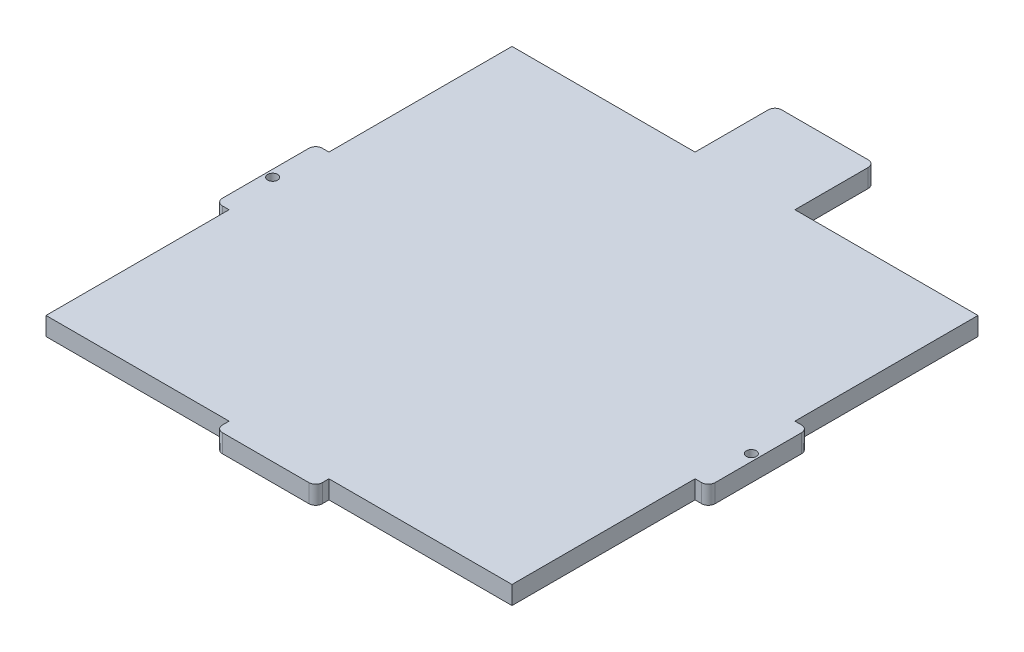
ISO-10303-21;
HEADER;
FILE_DESCRIPTION(('STEP AP214'),'2;1');
FILE_NAME('part.step','',(''),(''),'','','');
FILE_SCHEMA(('AUTOMOTIVE_DESIGN { 1 0 10303 214 1 1 1 1 }'));
ENDSEC;
DATA;
#1=APPLICATION_CONTEXT('core data for automotive mechanical design processes');
#2=APPLICATION_PROTOCOL_DEFINITION('international standard','automotive_design',2000,#1);
#3=PRODUCT_CONTEXT('',#1,'mechanical');
#4=PRODUCT('Part','Part','',(#3));
#5=PRODUCT_RELATED_PRODUCT_CATEGORY('part','',(#4));
#6=PRODUCT_DEFINITION_FORMATION('','',#4);
#7=PRODUCT_DEFINITION_CONTEXT('part definition',#1,'design');
#8=PRODUCT_DEFINITION('design','',#6,#7);
#9=PRODUCT_DEFINITION_SHAPE('','',#8);
#10=(LENGTH_UNIT() NAMED_UNIT(*) SI_UNIT(.MILLI.,.METRE.));
#11=(NAMED_UNIT(*) PLANE_ANGLE_UNIT() SI_UNIT($,.RADIAN.));
#12=(NAMED_UNIT(*) SI_UNIT($,.STERADIAN.) SOLID_ANGLE_UNIT());
#13=UNCERTAINTY_MEASURE_WITH_UNIT(LENGTH_MEASURE(1.E-05),#10,'distance_accuracy_value','');
#14=(GEOMETRIC_REPRESENTATION_CONTEXT(3) GLOBAL_UNCERTAINTY_ASSIGNED_CONTEXT((#13)) GLOBAL_UNIT_ASSIGNED_CONTEXT((#10,
#11,#12)) REPRESENTATION_CONTEXT('',''));
#15=CARTESIAN_POINT('',(0.,0.,0.));
#16=DIRECTION('',(0.,0.,1.));
#17=DIRECTION('',(1.,0.,0.));
#18=AXIS2_PLACEMENT_3D('',#15,#16,#17);
#19=CARTESIAN_POINT('',(0.,5.5,0.));
#20=DIRECTION('',(0.,1.,0.));
#21=DIRECTION('',(0.,0.,1.));
#22=AXIS2_PLACEMENT_3D('',#19,#20,#21);
#23=PLANE('',#22);
#24=CARTESIAN_POINT('',(-1.9,5.5,-70.));
#25=DIRECTION('',(0.,1.,0.));
#26=DIRECTION('',(0.,0.,1.));
#27=AXIS2_PLACEMENT_3D('',#24,#25,#26);
#28=CIRCLE('',#27,1.5);
#29=CARTESIAN_POINT('',(-1.9,5.5,-68.5));
#30=VERTEX_POINT('',#29);
#31=EDGE_CURVE('E453',#30,#30,#28,.T.);
#32=ORIENTED_EDGE('',*,*,#31,.F.);
#33=EDGE_LOOP('',(#32));
#34=FACE_BOUND('',#33,.T.);
#35=DIRECTION('',(-1.,0.,0.));
#36=VECTOR('',#35,1.);
#37=CARTESIAN_POINT('',(55.,5.5,-164.));
#38=LINE('',#37,#36);
#39=CARTESIAN_POINT('',(83.,5.5,-164.));
#40=VERTEX_POINT('',#39);
#41=CARTESIAN_POINT('',(57.,5.5,-164.));
#42=VERTEX_POINT('',#41);
#43=EDGE_CURVE('E437',#40,#42,#38,.T.);
#44=ORIENTED_EDGE('',*,*,#43,.T.);
#45=CARTESIAN_POINT('',(57.,5.5,-162.));
#46=DIRECTION('',(0.,1.,0.));
#47=DIRECTION('',(0.,0.,1.));
#48=AXIS2_PLACEMENT_3D('',#45,#46,#47);
#49=CIRCLE('',#48,2.);
#50=CARTESIAN_POINT('',(55.,5.5,-162.));
#51=VERTEX_POINT('',#50);
#52=EDGE_CURVE('E286',#42,#51,#49,.T.);
#53=ORIENTED_EDGE('',*,*,#52,.T.);
#54=DIRECTION('',(0.,0.,1.));
#55=VECTOR('',#54,1.);
#56=CARTESIAN_POINT('',(55.,5.5,-140.));
#57=LINE('',#56,#55);
#58=CARTESIAN_POINT('',(55.,5.5,-140.));
#59=VERTEX_POINT('',#58);
#60=EDGE_CURVE('E439',#51,#59,#57,.T.);
#61=ORIENTED_EDGE('',*,*,#60,.T.);
#62=DIRECTION('',(-1.,0.,0.));
#63=VECTOR('',#62,1.);
#64=CARTESIAN_POINT('',(0.,5.5,-140.));
#65=LINE('',#64,#63);
#66=CARTESIAN_POINT('',(0.,5.5,-140.));
#67=VERTEX_POINT('',#66);
#68=EDGE_CURVE('E441',#59,#67,#65,.T.);
#69=ORIENTED_EDGE('',*,*,#68,.T.);
#70=DIRECTION('',(0.,0.,1.));
#71=VECTOR('',#70,1.);
#72=CARTESIAN_POINT('',(0.,5.5,-85.));
#73=LINE('',#72,#71);
#74=CARTESIAN_POINT('',(0.,5.5,-85.));
#75=VERTEX_POINT('',#74);
#76=EDGE_CURVE('E443',#67,#75,#73,.T.);
#77=ORIENTED_EDGE('',*,*,#76,.T.);
#78=DIRECTION('',(-1.,0.,0.));
#79=VECTOR('',#78,1.);
#80=CARTESIAN_POINT('',(0.,5.5,-85.));
#81=LINE('',#80,#79);
#82=CARTESIAN_POINT('',(-2.,5.5,-85.));
#83=VERTEX_POINT('',#82);
#84=EDGE_CURVE('E445',#75,#83,#81,.T.);
#85=ORIENTED_EDGE('',*,*,#84,.T.);
#86=CARTESIAN_POINT('',(-2.,5.5,-83.));
#87=DIRECTION('',(0.,1.,0.));
#88=DIRECTION('',(0.,0.,1.));
#89=AXIS2_PLACEMENT_3D('',#86,#87,#88);
#90=CIRCLE('',#89,2.);
#91=CARTESIAN_POINT('',(-4.,5.5,-83.));
#92=VERTEX_POINT('',#91);
#93=EDGE_CURVE('E284',#83,#92,#90,.T.);
#94=ORIENTED_EDGE('',*,*,#93,.T.);
#95=DIRECTION('',(0.,0.,1.));
#96=VECTOR('',#95,1.);
#97=CARTESIAN_POINT('',(-4.,5.5,-85.));
#98=LINE('',#97,#96);
#99=CARTESIAN_POINT('',(-4.,5.5,-57.));
#100=VERTEX_POINT('',#99);
#101=EDGE_CURVE('E448',#92,#100,#98,.T.);
#102=ORIENTED_EDGE('',*,*,#101,.T.);
#103=CARTESIAN_POINT('',(-2.,5.5,-57.));
#104=DIRECTION('',(0.,1.,0.));
#105=DIRECTION('',(0.,0.,1.));
#106=AXIS2_PLACEMENT_3D('',#103,#104,#105);
#107=CIRCLE('',#106,2.);
#108=CARTESIAN_POINT('',(-2.,5.5,-55.));
#109=VERTEX_POINT('',#108);
#110=EDGE_CURVE('E48',#100,#109,#107,.T.);
#111=ORIENTED_EDGE('',*,*,#110,.T.);
#112=DIRECTION('',(1.,0.,0.));
#113=VECTOR('',#112,1.);
#114=CARTESIAN_POINT('',(0.,5.5,-55.));
#115=LINE('',#114,#113);
#116=CARTESIAN_POINT('',(0.,5.5,-55.));
#117=VERTEX_POINT('',#116);
#118=EDGE_CURVE('E235',#109,#117,#115,.T.);
#119=ORIENTED_EDGE('',*,*,#118,.T.);
#120=DIRECTION('',(0.,0.,1.));
#121=VECTOR('',#120,1.);
#122=CARTESIAN_POINT('',(0.,5.5,0.));
#123=LINE('',#122,#121);
#124=CARTESIAN_POINT('',(0.,5.5,0.));
#125=VERTEX_POINT('',#124);
#126=EDGE_CURVE('E230',#117,#125,#123,.T.);
#127=ORIENTED_EDGE('',*,*,#126,.T.);
#128=DIRECTION('',(1.,0.,0.));
#129=VECTOR('',#128,1.);
#130=CARTESIAN_POINT('',(0.,5.5,0.));
#131=LINE('',#130,#129);
#132=CARTESIAN_POINT('',(55.,5.5,0.));
#133=VERTEX_POINT('',#132);
#134=EDGE_CURVE('E219',#125,#133,#131,.T.);
#135=ORIENTED_EDGE('',*,*,#134,.T.);
#136=DIRECTION('',(0.,0.,1.));
#137=VECTOR('',#136,1.);
#138=CARTESIAN_POINT('',(55.,5.5,0.));
#139=LINE('',#138,#137);
#140=CARTESIAN_POINT('',(55.,5.5,2.));
#141=VERTEX_POINT('',#140);
#142=EDGE_CURVE('E229',#133,#141,#139,.T.);
#143=ORIENTED_EDGE('',*,*,#142,.T.);
#144=CARTESIAN_POINT('',(57.,5.5,2.));
#145=DIRECTION('',(0.,1.,0.));
#146=DIRECTION('',(0.,0.,1.));
#147=AXIS2_PLACEMENT_3D('',#144,#145,#146);
#148=CIRCLE('',#147,2.);
#149=CARTESIAN_POINT('',(57.,5.5,4.));
#150=VERTEX_POINT('',#149);
#151=EDGE_CURVE('E281',#141,#150,#148,.T.);
#152=ORIENTED_EDGE('',*,*,#151,.T.);
#153=DIRECTION('',(1.,0.,0.));
#154=VECTOR('',#153,1.);
#155=CARTESIAN_POINT('',(55.,5.5,4.));
#156=LINE('',#155,#154);
#157=CARTESIAN_POINT('',(83.,5.5,4.));
#158=VERTEX_POINT('',#157);
#159=EDGE_CURVE('E470',#150,#158,#156,.T.);
#160=ORIENTED_EDGE('',*,*,#159,.T.);
#161=CARTESIAN_POINT('',(83.,5.5,2.));
#162=DIRECTION('',(0.,1.,0.));
#163=DIRECTION('',(0.,0.,1.));
#164=AXIS2_PLACEMENT_3D('',#161,#162,#163);
#165=CIRCLE('',#164,2.);
#166=CARTESIAN_POINT('',(85.,5.5,2.));
#167=VERTEX_POINT('',#166);
#168=EDGE_CURVE('E279',#158,#167,#165,.T.);
#169=ORIENTED_EDGE('',*,*,#168,.T.);
#170=DIRECTION('',(0.,0.,-1.));
#171=VECTOR('',#170,1.);
#172=CARTESIAN_POINT('',(85.,5.5,0.));
#173=LINE('',#172,#171);
#174=CARTESIAN_POINT('',(85.,5.5,0.));
#175=VERTEX_POINT('',#174);
#176=EDGE_CURVE('E469',#167,#175,#173,.T.);
#177=ORIENTED_EDGE('',*,*,#176,.T.);
#178=DIRECTION('',(1.,0.,0.));
#179=VECTOR('',#178,1.);
#180=CARTESIAN_POINT('',(85.,5.5,0.));
#181=LINE('',#180,#179);
#182=CARTESIAN_POINT('',(140.,5.5,0.));
#183=VERTEX_POINT('',#182);
#184=EDGE_CURVE('E393',#175,#183,#181,.T.);
#185=ORIENTED_EDGE('',*,*,#184,.T.);
#186=DIRECTION('',(0.,0.,-1.));
#187=VECTOR('',#186,1.);
#188=CARTESIAN_POINT('',(140.,5.5,0.));
#189=LINE('',#188,#187);
#190=CARTESIAN_POINT('',(140.,5.5,-55.));
#191=VERTEX_POINT('',#190);
#192=EDGE_CURVE('E427',#183,#191,#189,.T.);
#193=ORIENTED_EDGE('',*,*,#192,.T.);
#194=DIRECTION('',(1.,0.,0.));
#195=VECTOR('',#194,1.);
#196=CARTESIAN_POINT('',(140.,5.5,-55.));
#197=LINE('',#196,#195);
#198=CARTESIAN_POINT('',(142.,5.5,-55.));
#199=VERTEX_POINT('',#198);
#200=EDGE_CURVE('E420',#191,#199,#197,.T.);
#201=ORIENTED_EDGE('',*,*,#200,.T.);
#202=CARTESIAN_POINT('',(142.,5.5,-57.));
#203=DIRECTION('',(0.,1.,0.));
#204=DIRECTION('',(0.,0.,1.));
#205=AXIS2_PLACEMENT_3D('',#202,#203,#204);
#206=CIRCLE('',#205,2.);
#207=CARTESIAN_POINT('',(144.,5.5,-57.));
#208=VERTEX_POINT('',#207);
#209=EDGE_CURVE('E277',#199,#208,#206,.T.);
#210=ORIENTED_EDGE('',*,*,#209,.T.);
#211=DIRECTION('',(0.,0.,-1.));
#212=VECTOR('',#211,1.);
#213=CARTESIAN_POINT('',(144.,5.5,-85.));
#214=LINE('',#213,#212);
#215=CARTESIAN_POINT('',(144.,5.5,-83.));
#216=VERTEX_POINT('',#215);
#217=EDGE_CURVE('E419',#208,#216,#214,.T.);
#218=ORIENTED_EDGE('',*,*,#217,.T.);
#219=CARTESIAN_POINT('',(142.,5.5,-83.));
#220=DIRECTION('',(0.,1.,0.));
#221=DIRECTION('',(0.,0.,1.));
#222=AXIS2_PLACEMENT_3D('',#219,#220,#221);
#223=CIRCLE('',#222,2.);
#224=CARTESIAN_POINT('',(142.,5.5,-85.));
#225=VERTEX_POINT('',#224);
#226=EDGE_CURVE('E275',#216,#225,#223,.T.);
#227=ORIENTED_EDGE('',*,*,#226,.T.);
#228=DIRECTION('',(-1.,0.,0.));
#229=VECTOR('',#228,1.);
#230=CARTESIAN_POINT('',(140.,5.5,-85.));
#231=LINE('',#230,#229);
#232=CARTESIAN_POINT('',(140.,5.5,-85.));
#233=VERTEX_POINT('',#232);
#234=EDGE_CURVE('E322',#225,#233,#231,.T.);
#235=ORIENTED_EDGE('',*,*,#234,.T.);
#236=DIRECTION('',(0.,0.,-1.));
#237=VECTOR('',#236,1.);
#238=CARTESIAN_POINT('',(140.,5.5,-85.));
#239=LINE('',#238,#237);
#240=CARTESIAN_POINT('',(140.,5.5,-140.));
#241=VERTEX_POINT('',#240);
#242=EDGE_CURVE('E425',#233,#241,#239,.T.);
#243=ORIENTED_EDGE('',*,*,#242,.T.);
#244=DIRECTION('',(-1.,0.,0.));
#245=VECTOR('',#244,1.);
#246=CARTESIAN_POINT('',(85.,5.5,-140.));
#247=LINE('',#246,#245);
#248=CARTESIAN_POINT('',(85.,5.5,-140.));
#249=VERTEX_POINT('',#248);
#250=EDGE_CURVE('E432',#241,#249,#247,.T.);
#251=ORIENTED_EDGE('',*,*,#250,.T.);
#252=DIRECTION('',(0.,0.,-1.));
#253=VECTOR('',#252,1.);
#254=CARTESIAN_POINT('',(85.,5.5,-140.));
#255=LINE('',#254,#253);
#256=CARTESIAN_POINT('',(85.,5.5,-162.));
#257=VERTEX_POINT('',#256);
#258=EDGE_CURVE('E434',#249,#257,#255,.T.);
#259=ORIENTED_EDGE('',*,*,#258,.T.);
#260=CARTESIAN_POINT('',(83.,5.5,-162.));
#261=DIRECTION('',(0.,1.,0.));
#262=DIRECTION('',(0.,0.,1.));
#263=AXIS2_PLACEMENT_3D('',#260,#261,#262);
#264=CIRCLE('',#263,2.);
#265=EDGE_CURVE('E273',#257,#40,#264,.T.);
#266=ORIENTED_EDGE('',*,*,#265,.T.);
#267=EDGE_LOOP('',(#44,#53,#61,#69,#77,#85,#94,#102,#111,#119,#127,#135,#143,#152,#160,#169,
#177,#185,#193,#201,#210,#218,#227,#235,#243,#251,#259,#266));
#268=FACE_BOUND('',#267,.T.);
#269=CARTESIAN_POINT('',(141.9,5.5,-70.));
#270=DIRECTION('',(0.,1.,0.));
#271=DIRECTION('',(0.,0.,1.));
#272=AXIS2_PLACEMENT_3D('',#269,#270,#271);
#273=CIRCLE('',#272,1.5);
#274=CARTESIAN_POINT('',(141.9,5.5,-68.5));
#275=VERTEX_POINT('',#274);
#276=EDGE_CURVE('E778',#275,#275,#273,.T.);
#277=ORIENTED_EDGE('',*,*,#276,.F.);
#278=EDGE_LOOP('',(#277));
#279=FACE_BOUND('',#278,.T.);
#280=ADVANCED_FACE('F33',(#34,#268,#279),#23,.T.);
#281=CARTESIAN_POINT('',(0.,0.,0.));
#282=DIRECTION('',(0.,1.,0.));
#283=DIRECTION('',(0.,0.,1.));
#284=AXIS2_PLACEMENT_3D('',#281,#282,#283);
#285=PLANE('',#284);
#286=CARTESIAN_POINT('',(-1.9,0.,-70.));
#287=DIRECTION('',(0.,1.,0.));
#288=DIRECTION('',(0.,0.,1.));
#289=AXIS2_PLACEMENT_3D('',#286,#287,#288);
#290=CIRCLE('',#289,1.5);
#291=CARTESIAN_POINT('',(-1.9,0.,-68.5));
#292=VERTEX_POINT('',#291);
#293=EDGE_CURVE('E775',#292,#292,#290,.T.);
#294=ORIENTED_EDGE('',*,*,#293,.T.);
#295=EDGE_LOOP('',(#294));
#296=FACE_BOUND('',#295,.T.);
#297=DIRECTION('',(0.,0.,1.));
#298=VECTOR('',#297,1.);
#299=CARTESIAN_POINT('',(55.,0.,-140.));
#300=LINE('',#299,#298);
#301=CARTESIAN_POINT('',(55.,0.,-162.));
#302=VERTEX_POINT('',#301);
#303=CARTESIAN_POINT('',(55.,0.,-140.));
#304=VERTEX_POINT('',#303);
#305=EDGE_CURVE('E349',#302,#304,#300,.T.);
#306=ORIENTED_EDGE('',*,*,#305,.F.);
#307=CARTESIAN_POINT('',(57.,0.,-162.));
#308=DIRECTION('',(0.,1.,0.));
#309=DIRECTION('',(0.,0.,1.));
#310=AXIS2_PLACEMENT_3D('',#307,#308,#309);
#311=CIRCLE('',#310,2.);
#312=CARTESIAN_POINT('',(57.,0.,-164.));
#313=VERTEX_POINT('',#312);
#314=EDGE_CURVE('E266',#302,#313,#311,.F.);
#315=ORIENTED_EDGE('',*,*,#314,.T.);
#316=DIRECTION('',(-1.,0.,0.));
#317=VECTOR('',#316,1.);
#318=CARTESIAN_POINT('',(55.,0.,-164.));
#319=LINE('',#318,#317);
#320=CARTESIAN_POINT('',(83.,0.,-164.));
#321=VERTEX_POINT('',#320);
#322=EDGE_CURVE('E346',#321,#313,#319,.T.);
#323=ORIENTED_EDGE('',*,*,#322,.F.);
#324=CARTESIAN_POINT('',(83.,0.,-162.));
#325=DIRECTION('',(0.,1.,0.));
#326=DIRECTION('',(0.,0.,1.));
#327=AXIS2_PLACEMENT_3D('',#324,#325,#326);
#328=CIRCLE('',#327,2.);
#329=CARTESIAN_POINT('',(85.,0.,-162.));
#330=VERTEX_POINT('',#329);
#331=EDGE_CURVE('E247',#321,#330,#328,.F.);
#332=ORIENTED_EDGE('',*,*,#331,.T.);
#333=DIRECTION('',(0.,0.,-1.));
#334=VECTOR('',#333,1.);
#335=CARTESIAN_POINT('',(85.,0.,-140.));
#336=LINE('',#335,#334);
#337=CARTESIAN_POINT('',(85.,0.,-140.));
#338=VERTEX_POINT('',#337);
#339=EDGE_CURVE('E343',#338,#330,#336,.T.);
#340=ORIENTED_EDGE('',*,*,#339,.F.);
#341=DIRECTION('',(-1.,0.,0.));
#342=VECTOR('',#341,1.);
#343=CARTESIAN_POINT('',(85.,0.,-140.));
#344=LINE('',#343,#342);
#345=CARTESIAN_POINT('',(140.,0.,-140.));
#346=VERTEX_POINT('',#345);
#347=EDGE_CURVE('E336',#346,#338,#344,.T.);
#348=ORIENTED_EDGE('',*,*,#347,.F.);
#349=DIRECTION('',(0.,0.,-1.));
#350=VECTOR('',#349,1.);
#351=CARTESIAN_POINT('',(140.,0.,-85.));
#352=LINE('',#351,#350);
#353=CARTESIAN_POINT('',(140.,0.,-85.));
#354=VERTEX_POINT('',#353);
#355=EDGE_CURVE('E333',#354,#346,#352,.T.);
#356=ORIENTED_EDGE('',*,*,#355,.F.);
#357=DIRECTION('',(-1.,0.,0.));
#358=VECTOR('',#357,1.);
#359=CARTESIAN_POINT('',(140.,0.,-85.));
#360=LINE('',#359,#358);
#361=CARTESIAN_POINT('',(142.,0.,-85.));
#362=VERTEX_POINT('',#361);
#363=EDGE_CURVE('E320',#362,#354,#360,.T.);
#364=ORIENTED_EDGE('',*,*,#363,.F.);
#365=CARTESIAN_POINT('',(142.,0.,-83.));
#366=DIRECTION('',(0.,1.,0.));
#367=DIRECTION('',(0.,0.,1.));
#368=AXIS2_PLACEMENT_3D('',#365,#366,#367);
#369=CIRCLE('',#368,2.);
#370=CARTESIAN_POINT('',(144.,0.,-83.));
#371=VERTEX_POINT('',#370);
#372=EDGE_CURVE('E254',#362,#371,#369,.F.);
#373=ORIENTED_EDGE('',*,*,#372,.T.);
#374=DIRECTION('',(0.,0.,-1.));
#375=VECTOR('',#374,1.);
#376=CARTESIAN_POINT('',(144.,0.,-85.));
#377=LINE('',#376,#375);
#378=CARTESIAN_POINT('',(144.,0.,-57.));
#379=VERTEX_POINT('',#378);
#380=EDGE_CURVE('E334',#379,#371,#377,.T.);
#381=ORIENTED_EDGE('',*,*,#380,.F.);
#382=CARTESIAN_POINT('',(142.,0.,-57.));
#383=DIRECTION('',(0.,1.,0.));
#384=DIRECTION('',(0.,0.,1.));
#385=AXIS2_PLACEMENT_3D('',#382,#383,#384);
#386=CIRCLE('',#385,2.);
#387=CARTESIAN_POINT('',(142.,0.,-55.));
#388=VERTEX_POINT('',#387);
#389=EDGE_CURVE('E256',#379,#388,#386,.F.);
#390=ORIENTED_EDGE('',*,*,#389,.T.);
#391=DIRECTION('',(1.,0.,0.));
#392=VECTOR('',#391,1.);
#393=CARTESIAN_POINT('',(140.,0.,-55.));
#394=LINE('',#393,#392);
#395=CARTESIAN_POINT('',(140.,0.,-55.));
#396=VERTEX_POINT('',#395);
#397=EDGE_CURVE('E338',#396,#388,#394,.T.);
#398=ORIENTED_EDGE('',*,*,#397,.F.);
#399=DIRECTION('',(0.,0.,-1.));
#400=VECTOR('',#399,1.);
#401=CARTESIAN_POINT('',(140.,0.,0.));
#402=LINE('',#401,#400);
#403=CARTESIAN_POINT('',(140.,0.,0.));
#404=VERTEX_POINT('',#403);
#405=EDGE_CURVE('E400',#404,#396,#402,.T.);
#406=ORIENTED_EDGE('',*,*,#405,.F.);
#407=DIRECTION('',(1.,0.,0.));
#408=VECTOR('',#407,1.);
#409=CARTESIAN_POINT('',(85.,0.,0.));
#410=LINE('',#409,#408);
#411=CARTESIAN_POINT('',(85.,0.,0.));
#412=VERTEX_POINT('',#411);
#413=EDGE_CURVE('E392',#412,#404,#410,.T.);
#414=ORIENTED_EDGE('',*,*,#413,.F.);
#415=DIRECTION('',(0.,0.,-1.));
#416=VECTOR('',#415,1.);
#417=CARTESIAN_POINT('',(85.,0.,0.));
#418=LINE('',#417,#416);
#419=CARTESIAN_POINT('',(85.,0.,2.));
#420=VERTEX_POINT('',#419);
#421=EDGE_CURVE('E398',#420,#412,#418,.T.);
#422=ORIENTED_EDGE('',*,*,#421,.F.);
#423=CARTESIAN_POINT('',(83.,0.,2.));
#424=DIRECTION('',(0.,1.,0.));
#425=DIRECTION('',(0.,0.,1.));
#426=AXIS2_PLACEMENT_3D('',#423,#424,#425);
#427=CIRCLE('',#426,2.);
#428=CARTESIAN_POINT('',(83.,0.,4.));
#429=VERTEX_POINT('',#428);
#430=EDGE_CURVE('E258',#420,#429,#427,.F.);
#431=ORIENTED_EDGE('',*,*,#430,.T.);
#432=DIRECTION('',(1.,0.,0.));
#433=VECTOR('',#432,1.);
#434=CARTESIAN_POINT('',(55.,0.,4.));
#435=LINE('',#434,#433);
#436=CARTESIAN_POINT('',(57.,0.,4.));
#437=VERTEX_POINT('',#436);
#438=EDGE_CURVE('E403',#437,#429,#435,.T.);
#439=ORIENTED_EDGE('',*,*,#438,.F.);
#440=CARTESIAN_POINT('',(57.,0.,2.));
#441=DIRECTION('',(0.,1.,0.));
#442=DIRECTION('',(0.,0.,1.));
#443=AXIS2_PLACEMENT_3D('',#440,#441,#442);
#444=CIRCLE('',#443,2.);
#445=CARTESIAN_POINT('',(55.,0.,2.));
#446=VERTEX_POINT('',#445);
#447=EDGE_CURVE('E260',#437,#446,#444,.F.);
#448=ORIENTED_EDGE('',*,*,#447,.T.);
#449=DIRECTION('',(0.,0.,1.));
#450=VECTOR('',#449,1.);
#451=CARTESIAN_POINT('',(55.,0.,0.));
#452=LINE('',#451,#450);
#453=CARTESIAN_POINT('',(55.,0.,0.));
#454=VERTEX_POINT('',#453);
#455=EDGE_CURVE('E455',#454,#446,#452,.T.);
#456=ORIENTED_EDGE('',*,*,#455,.F.);
#457=DIRECTION('',(1.,0.,0.));
#458=VECTOR('',#457,1.);
#459=CARTESIAN_POINT('',(0.,0.,0.));
#460=LINE('',#459,#458);
#461=CARTESIAN_POINT('',(0.,0.,0.));
#462=VERTEX_POINT('',#461);
#463=EDGE_CURVE('E452',#462,#454,#460,.T.);
#464=ORIENTED_EDGE('',*,*,#463,.F.);
#465=DIRECTION('',(0.,0.,1.));
#466=VECTOR('',#465,1.);
#467=CARTESIAN_POINT('',(0.,0.,0.));
#468=LINE('',#467,#466);
#469=CARTESIAN_POINT('',(0.,0.,-55.));
#470=VERTEX_POINT('',#469);
#471=EDGE_CURVE('E243',#470,#462,#468,.T.);
#472=ORIENTED_EDGE('',*,*,#471,.F.);
#473=DIRECTION('',(1.,0.,0.));
#474=VECTOR('',#473,1.);
#475=CARTESIAN_POINT('',(0.,0.,-55.));
#476=LINE('',#475,#474);
#477=CARTESIAN_POINT('',(-2.,0.,-55.));
#478=VERTEX_POINT('',#477);
#479=EDGE_CURVE('E239',#478,#470,#476,.T.);
#480=ORIENTED_EDGE('',*,*,#479,.F.);
#481=CARTESIAN_POINT('',(-2.,0.,-57.));
#482=DIRECTION('',(0.,1.,0.));
#483=DIRECTION('',(0.,0.,1.));
#484=AXIS2_PLACEMENT_3D('',#481,#482,#483);
#485=CIRCLE('',#484,2.);
#486=CARTESIAN_POINT('',(-4.,0.,-57.));
#487=VERTEX_POINT('',#486);
#488=EDGE_CURVE('E262',#478,#487,#485,.F.);
#489=ORIENTED_EDGE('',*,*,#488,.T.);
#490=DIRECTION('',(0.,0.,1.));
#491=VECTOR('',#490,1.);
#492=CARTESIAN_POINT('',(-4.,0.,-85.));
#493=LINE('',#492,#491);
#494=CARTESIAN_POINT('',(-4.,0.,-83.));
#495=VERTEX_POINT('',#494);
#496=EDGE_CURVE('E358',#495,#487,#493,.T.);
#497=ORIENTED_EDGE('',*,*,#496,.F.);
#498=CARTESIAN_POINT('',(-2.,0.,-83.));
#499=DIRECTION('',(0.,1.,0.));
#500=DIRECTION('',(0.,0.,1.));
#501=AXIS2_PLACEMENT_3D('',#498,#499,#500);
#502=CIRCLE('',#501,2.);
#503=CARTESIAN_POINT('',(-2.,0.,-85.));
#504=VERTEX_POINT('',#503);
#505=EDGE_CURVE('E264',#495,#504,#502,.F.);
#506=ORIENTED_EDGE('',*,*,#505,.T.);
#507=DIRECTION('',(-1.,0.,0.));
#508=VECTOR('',#507,1.);
#509=CARTESIAN_POINT('',(0.,0.,-85.));
#510=LINE('',#509,#508);
#511=CARTESIAN_POINT('',(0.,0.,-85.));
#512=VERTEX_POINT('',#511);
#513=EDGE_CURVE('E355',#512,#504,#510,.T.);
#514=ORIENTED_EDGE('',*,*,#513,.F.);
#515=DIRECTION('',(0.,0.,1.));
#516=VECTOR('',#515,1.);
#517=CARTESIAN_POINT('',(0.,0.,-85.));
#518=LINE('',#517,#516);
#519=CARTESIAN_POINT('',(0.,0.,-140.));
#520=VERTEX_POINT('',#519);
#521=EDGE_CURVE('E353',#520,#512,#518,.T.);
#522=ORIENTED_EDGE('',*,*,#521,.F.);
#523=DIRECTION('',(-1.,0.,0.));
#524=VECTOR('',#523,1.);
#525=CARTESIAN_POINT('',(0.,0.,-140.));
#526=LINE('',#525,#524);
#527=EDGE_CURVE('E351',#304,#520,#526,.T.);
#528=ORIENTED_EDGE('',*,*,#527,.F.);
#529=EDGE_LOOP('',(#306,#315,#323,#332,#340,#348,#356,#364,#373,#381,#390,#398,#406,#414,#422,
#431,#439,#448,#456,#464,#472,#480,#489,#497,#506,#514,#522,#528));
#530=FACE_BOUND('',#529,.T.);
#531=CARTESIAN_POINT('',(141.9,0.,-70.));
#532=DIRECTION('',(0.,1.,0.));
#533=DIRECTION('',(0.,0.,1.));
#534=AXIS2_PLACEMENT_3D('',#531,#532,#533);
#535=CIRCLE('',#534,1.5);
#536=CARTESIAN_POINT('',(141.9,0.,-68.5));
#537=VERTEX_POINT('',#536);
#538=EDGE_CURVE('E781',#537,#537,#535,.T.);
#539=ORIENTED_EDGE('',*,*,#538,.T.);
#540=EDGE_LOOP('',(#539));
#541=FACE_BOUND('',#540,.T.);
#542=ADVANCED_FACE('F328',(#296,#530,#541),#285,.F.);
#543=CARTESIAN_POINT('',(0.,5.5,0.));
#544=DIRECTION('',(1.,0.,0.));
#545=DIRECTION('',(0.,0.,-1.));
#546=AXIS2_PLACEMENT_3D('',#543,#544,#545);
#547=PLANE('',#546);
#548=ORIENTED_EDGE('',*,*,#471,.T.);
#549=DIRECTION('',(0.,-1.,0.));
#550=VECTOR('',#549,1.);
#551=CARTESIAN_POINT('',(0.,5.5,0.));
#552=LINE('',#551,#550);
#553=EDGE_CURVE('E223',#125,#462,#552,.T.);
#554=ORIENTED_EDGE('',*,*,#553,.F.);
#555=ORIENTED_EDGE('',*,*,#126,.F.);
#556=DIRECTION('',(0.,-1.,0.));
#557=VECTOR('',#556,1.);
#558=CARTESIAN_POINT('',(0.,5.5,-55.));
#559=LINE('',#558,#557);
#560=EDGE_CURVE('E361',#117,#470,#559,.T.);
#561=ORIENTED_EDGE('',*,*,#560,.T.);
#562=EDGE_LOOP('',(#548,#554,#555,#561));
#563=FACE_BOUND('',#562,.T.);
#564=ADVANCED_FACE('F241',(#563),#547,.F.);
#565=CARTESIAN_POINT('',(0.,5.5,0.));
#566=DIRECTION('',(0.,0.,-1.));
#567=DIRECTION('',(-1.,0.,0.));
#568=AXIS2_PLACEMENT_3D('',#565,#566,#567);
#569=PLANE('',#568);
#570=ORIENTED_EDGE('',*,*,#463,.T.);
#571=DIRECTION('',(0.,-1.,0.));
#572=VECTOR('',#571,1.);
#573=CARTESIAN_POINT('',(55.,5.5,0.));
#574=LINE('',#573,#572);
#575=EDGE_CURVE('E226',#133,#454,#574,.T.);
#576=ORIENTED_EDGE('',*,*,#575,.F.);
#577=ORIENTED_EDGE('',*,*,#134,.F.);
#578=ORIENTED_EDGE('',*,*,#553,.T.);
#579=EDGE_LOOP('',(#570,#576,#577,#578));
#580=FACE_BOUND('',#579,.T.);
#581=ADVANCED_FACE('F221',(#580),#569,.F.);
#582=CARTESIAN_POINT('',(55.,5.5,0.));
#583=DIRECTION('',(1.,0.,0.));
#584=DIRECTION('',(0.,0.,-1.));
#585=AXIS2_PLACEMENT_3D('',#582,#583,#584);
#586=PLANE('',#585);
#587=ORIENTED_EDGE('',*,*,#455,.T.);
#588=DIRECTION('',(0.,-1.,0.));
#589=VECTOR('',#588,1.);
#590=CARTESIAN_POINT('',(55.,5.5,2.));
#591=LINE('',#590,#589);
#592=EDGE_CURVE('E302',#446,#141,#591,.F.);
#593=ORIENTED_EDGE('',*,*,#592,.T.);
#594=ORIENTED_EDGE('',*,*,#142,.F.);
#595=ORIENTED_EDGE('',*,*,#575,.T.);
#596=EDGE_LOOP('',(#587,#593,#594,#595));
#597=FACE_BOUND('',#596,.T.);
#598=ADVANCED_FACE('F732',(#597),#586,.F.);
#599=CARTESIAN_POINT('',(55.,5.5,4.));
#600=DIRECTION('',(0.,0.,-1.));
#601=DIRECTION('',(-1.,0.,0.));
#602=AXIS2_PLACEMENT_3D('',#599,#600,#601);
#603=PLANE('',#602);
#604=ORIENTED_EDGE('',*,*,#159,.F.);
#605=DIRECTION('',(0.,-1.,0.));
#606=VECTOR('',#605,1.);
#607=CARTESIAN_POINT('',(57.,5.5,4.));
#608=LINE('',#607,#606);
#609=EDGE_CURVE('E299',#150,#437,#608,.T.);
#610=ORIENTED_EDGE('',*,*,#609,.T.);
#611=ORIENTED_EDGE('',*,*,#438,.T.);
#612=DIRECTION('',(0.,-1.,0.));
#613=VECTOR('',#612,1.);
#614=CARTESIAN_POINT('',(83.,5.5,4.));
#615=LINE('',#614,#613);
#616=EDGE_CURVE('E297',#429,#158,#615,.F.);
#617=ORIENTED_EDGE('',*,*,#616,.T.);
#618=EDGE_LOOP('',(#604,#610,#611,#617));
#619=FACE_BOUND('',#618,.T.);
#620=ADVANCED_FACE('F462',(#619),#603,.F.);
#621=CARTESIAN_POINT('',(85.,5.5,0.));
#622=DIRECTION('',(-1.,0.,0.));
#623=DIRECTION('',(0.,0.,1.));
#624=AXIS2_PLACEMENT_3D('',#621,#622,#623);
#625=PLANE('',#624);
#626=ORIENTED_EDGE('',*,*,#176,.F.);
#627=DIRECTION('',(0.,-1.,0.));
#628=VECTOR('',#627,1.);
#629=CARTESIAN_POINT('',(85.,5.5,2.));
#630=LINE('',#629,#628);
#631=EDGE_CURVE('E304',#167,#420,#630,.T.);
#632=ORIENTED_EDGE('',*,*,#631,.T.);
#633=ORIENTED_EDGE('',*,*,#421,.T.);
#634=DIRECTION('',(0.,-1.,0.));
#635=VECTOR('',#634,1.);
#636=CARTESIAN_POINT('',(85.,5.5,0.));
#637=LINE('',#636,#635);
#638=EDGE_CURVE('E249',#175,#412,#637,.T.);
#639=ORIENTED_EDGE('',*,*,#638,.F.);
#640=EDGE_LOOP('',(#626,#632,#633,#639));
#641=FACE_BOUND('',#640,.T.);
#642=ADVANCED_FACE('F471',(#641),#625,.F.);
#643=CARTESIAN_POINT('',(85.,5.5,0.));
#644=DIRECTION('',(0.,0.,-1.));
#645=DIRECTION('',(-1.,0.,0.));
#646=AXIS2_PLACEMENT_3D('',#643,#644,#645);
#647=PLANE('',#646);
#648=ORIENTED_EDGE('',*,*,#413,.T.);
#649=DIRECTION('',(0.,-1.,0.));
#650=VECTOR('',#649,1.);
#651=CARTESIAN_POINT('',(140.,5.5,0.));
#652=LINE('',#651,#650);
#653=EDGE_CURVE('E383',#183,#404,#652,.T.);
#654=ORIENTED_EDGE('',*,*,#653,.F.);
#655=ORIENTED_EDGE('',*,*,#184,.F.);
#656=ORIENTED_EDGE('',*,*,#638,.T.);
#657=EDGE_LOOP('',(#648,#654,#655,#656));
#658=FACE_BOUND('',#657,.T.);
#659=ADVANCED_FACE('F390',(#658),#647,.F.);
#660=CARTESIAN_POINT('',(140.,5.5,0.));
#661=DIRECTION('',(-1.,0.,0.));
#662=DIRECTION('',(0.,0.,1.));
#663=AXIS2_PLACEMENT_3D('',#660,#661,#662);
#664=PLANE('',#663);
#665=ORIENTED_EDGE('',*,*,#405,.T.);
#666=DIRECTION('',(0.,-1.,0.));
#667=VECTOR('',#666,1.);
#668=CARTESIAN_POINT('',(140.,5.5,-55.));
#669=LINE('',#668,#667);
#670=EDGE_CURVE('E380',#191,#396,#669,.T.);
#671=ORIENTED_EDGE('',*,*,#670,.F.);
#672=ORIENTED_EDGE('',*,*,#192,.F.);
#673=ORIENTED_EDGE('',*,*,#653,.T.);
#674=EDGE_LOOP('',(#665,#671,#672,#673));
#675=FACE_BOUND('',#674,.T.);
#676=ADVANCED_FACE('F478',(#675),#664,.F.);
#677=CARTESIAN_POINT('',(140.,5.5,-55.));
#678=DIRECTION('',(0.,0.,-1.));
#679=DIRECTION('',(-1.,0.,0.));
#680=AXIS2_PLACEMENT_3D('',#677,#678,#679);
#681=PLANE('',#680);
#682=ORIENTED_EDGE('',*,*,#397,.T.);
#683=DIRECTION('',(0.,-1.,0.));
#684=VECTOR('',#683,1.);
#685=CARTESIAN_POINT('',(142.,5.5,-55.));
#686=LINE('',#685,#684);
#687=EDGE_CURVE('E312',#388,#199,#686,.F.);
#688=ORIENTED_EDGE('',*,*,#687,.T.);
#689=ORIENTED_EDGE('',*,*,#200,.F.);
#690=ORIENTED_EDGE('',*,*,#670,.T.);
#691=EDGE_LOOP('',(#682,#688,#689,#690));
#692=FACE_BOUND('',#691,.T.);
#693=ADVANCED_FACE('F409',(#692),#681,.F.);
#694=CARTESIAN_POINT('',(144.,5.5,-85.));
#695=DIRECTION('',(-1.,0.,0.));
#696=DIRECTION('',(0.,0.,1.));
#697=AXIS2_PLACEMENT_3D('',#694,#695,#696);
#698=PLANE('',#697);
#699=ORIENTED_EDGE('',*,*,#217,.F.);
#700=DIRECTION('',(0.,-1.,0.));
#701=VECTOR('',#700,1.);
#702=CARTESIAN_POINT('',(144.,5.5,-57.));
#703=LINE('',#702,#701);
#704=EDGE_CURVE('E309',#208,#379,#703,.T.);
#705=ORIENTED_EDGE('',*,*,#704,.T.);
#706=ORIENTED_EDGE('',*,*,#380,.T.);
#707=DIRECTION('',(0.,-1.,0.));
#708=VECTOR('',#707,1.);
#709=CARTESIAN_POINT('',(144.,5.5,-83.));
#710=LINE('',#709,#708);
#711=EDGE_CURVE('E307',#371,#216,#710,.F.);
#712=ORIENTED_EDGE('',*,*,#711,.T.);
#713=EDGE_LOOP('',(#699,#705,#706,#712));
#714=FACE_BOUND('',#713,.T.);
#715=ADVANCED_FACE('F422',(#714),#698,.F.);
#716=CARTESIAN_POINT('',(140.,5.5,-85.));
#717=DIRECTION('',(0.,0.,1.));
#718=DIRECTION('',(1.,0.,0.));
#719=AXIS2_PLACEMENT_3D('',#716,#717,#718);
#720=PLANE('',#719);
#721=ORIENTED_EDGE('',*,*,#234,.F.);
#722=DIRECTION('',(0.,-1.,0.));
#723=VECTOR('',#722,1.);
#724=CARTESIAN_POINT('',(142.,5.5,-85.));
#725=LINE('',#724,#723);
#726=EDGE_CURVE('E41',#225,#362,#725,.T.);
#727=ORIENTED_EDGE('',*,*,#726,.T.);
#728=ORIENTED_EDGE('',*,*,#363,.T.);
#729=DIRECTION('',(0.,-1.,0.));
#730=VECTOR('',#729,1.);
#731=CARTESIAN_POINT('',(140.,5.5,-85.));
#732=LINE('',#731,#730);
#733=EDGE_CURVE('E378',#233,#354,#732,.T.);
#734=ORIENTED_EDGE('',*,*,#733,.F.);
#735=EDGE_LOOP('',(#721,#727,#728,#734));
#736=FACE_BOUND('',#735,.T.);
#737=ADVANCED_FACE('F318',(#736),#720,.F.);
#738=CARTESIAN_POINT('',(140.,5.5,-85.));
#739=DIRECTION('',(-1.,0.,0.));
#740=DIRECTION('',(0.,0.,1.));
#741=AXIS2_PLACEMENT_3D('',#738,#739,#740);
#742=PLANE('',#741);
#743=ORIENTED_EDGE('',*,*,#355,.T.);
#744=DIRECTION('',(0.,-1.,0.));
#745=VECTOR('',#744,1.);
#746=CARTESIAN_POINT('',(140.,5.5,-140.));
#747=LINE('',#746,#745);
#748=EDGE_CURVE('E375',#241,#346,#747,.T.);
#749=ORIENTED_EDGE('',*,*,#748,.F.);
#750=ORIENTED_EDGE('',*,*,#242,.F.);
#751=ORIENTED_EDGE('',*,*,#733,.T.);
#752=EDGE_LOOP('',(#743,#749,#750,#751));
#753=FACE_BOUND('',#752,.T.);
#754=ADVANCED_FACE('F534',(#753),#742,.F.);
#755=CARTESIAN_POINT('',(85.,5.5,-140.));
#756=DIRECTION('',(0.,0.,1.));
#757=DIRECTION('',(1.,0.,0.));
#758=AXIS2_PLACEMENT_3D('',#755,#756,#757);
#759=PLANE('',#758);
#760=ORIENTED_EDGE('',*,*,#347,.T.);
#761=DIRECTION('',(0.,-1.,0.));
#762=VECTOR('',#761,1.);
#763=CARTESIAN_POINT('',(85.,5.5,-140.));
#764=LINE('',#763,#762);
#765=EDGE_CURVE('E372',#249,#338,#764,.T.);
#766=ORIENTED_EDGE('',*,*,#765,.F.);
#767=ORIENTED_EDGE('',*,*,#250,.F.);
#768=ORIENTED_EDGE('',*,*,#748,.T.);
#769=EDGE_LOOP('',(#760,#766,#767,#768));
#770=FACE_BOUND('',#769,.T.);
#771=ADVANCED_FACE('F530',(#770),#759,.F.);
#772=CARTESIAN_POINT('',(85.,5.5,-140.));
#773=DIRECTION('',(-1.,0.,0.));
#774=DIRECTION('',(0.,0.,1.));
#775=AXIS2_PLACEMENT_3D('',#772,#773,#774);
#776=PLANE('',#775);
#777=ORIENTED_EDGE('',*,*,#339,.T.);
#778=DIRECTION('',(0.,-1.,0.));
#779=VECTOR('',#778,1.);
#780=CARTESIAN_POINT('',(85.,5.5,-162.));
#781=LINE('',#780,#779);
#782=EDGE_CURVE('E11',#330,#257,#781,.F.);
#783=ORIENTED_EDGE('',*,*,#782,.T.);
#784=ORIENTED_EDGE('',*,*,#258,.F.);
#785=ORIENTED_EDGE('',*,*,#765,.T.);
#786=EDGE_LOOP('',(#777,#783,#784,#785));
#787=FACE_BOUND('',#786,.T.);
#788=ADVANCED_FACE('F526',(#787),#776,.F.);
#789=CARTESIAN_POINT('',(55.,5.5,-164.));
#790=DIRECTION('',(0.,0.,1.));
#791=DIRECTION('',(1.,0.,0.));
#792=AXIS2_PLACEMENT_3D('',#789,#790,#791);
#793=PLANE('',#792);
#794=ORIENTED_EDGE('',*,*,#322,.T.);
#795=DIRECTION('',(0.,-1.,0.));
#796=VECTOR('',#795,1.);
#797=CARTESIAN_POINT('',(57.,5.5,-164.));
#798=LINE('',#797,#796);
#799=EDGE_CURVE('E271',#313,#42,#798,.F.);
#800=ORIENTED_EDGE('',*,*,#799,.T.);
#801=ORIENTED_EDGE('',*,*,#43,.F.);
#802=DIRECTION('',(0.,-1.,0.));
#803=VECTOR('',#802,1.);
#804=CARTESIAN_POINT('',(83.,5.5,-164.));
#805=LINE('',#804,#803);
#806=EDGE_CURVE('E268',#40,#321,#805,.T.);
#807=ORIENTED_EDGE('',*,*,#806,.T.);
#808=EDGE_LOOP('',(#794,#800,#801,#807));
#809=FACE_BOUND('',#808,.T.);
#810=ADVANCED_FACE('F522',(#809),#793,.F.);
#811=CARTESIAN_POINT('',(55.,5.5,-140.));
#812=DIRECTION('',(1.,0.,0.));
#813=DIRECTION('',(0.,0.,-1.));
#814=AXIS2_PLACEMENT_3D('',#811,#812,#813);
#815=PLANE('',#814);
#816=ORIENTED_EDGE('',*,*,#60,.F.);
#817=DIRECTION('',(0.,-1.,0.));
#818=VECTOR('',#817,1.);
#819=CARTESIAN_POINT('',(55.,5.5,-162.));
#820=LINE('',#819,#818);
#821=EDGE_CURVE('E244',#51,#302,#820,.T.);
#822=ORIENTED_EDGE('',*,*,#821,.T.);
#823=ORIENTED_EDGE('',*,*,#305,.T.);
#824=DIRECTION('',(0.,-1.,0.));
#825=VECTOR('',#824,1.);
#826=CARTESIAN_POINT('',(55.,5.5,-140.));
#827=LINE('',#826,#825);
#828=EDGE_CURVE('E369',#59,#304,#827,.T.);
#829=ORIENTED_EDGE('',*,*,#828,.F.);
#830=EDGE_LOOP('',(#816,#822,#823,#829));
#831=FACE_BOUND('',#830,.T.);
#832=ADVANCED_FACE('F518',(#831),#815,.F.);
#833=CARTESIAN_POINT('',(0.,5.5,-140.));
#834=DIRECTION('',(0.,0.,1.));
#835=DIRECTION('',(1.,0.,0.));
#836=AXIS2_PLACEMENT_3D('',#833,#834,#835);
#837=PLANE('',#836);
#838=ORIENTED_EDGE('',*,*,#527,.T.);
#839=DIRECTION('',(0.,-1.,0.));
#840=VECTOR('',#839,1.);
#841=CARTESIAN_POINT('',(0.,5.5,-140.));
#842=LINE('',#841,#840);
#843=EDGE_CURVE('E366',#67,#520,#842,.T.);
#844=ORIENTED_EDGE('',*,*,#843,.F.);
#845=ORIENTED_EDGE('',*,*,#68,.F.);
#846=ORIENTED_EDGE('',*,*,#828,.T.);
#847=EDGE_LOOP('',(#838,#844,#845,#846));
#848=FACE_BOUND('',#847,.T.);
#849=ADVANCED_FACE('F514',(#848),#837,.F.);
#850=CARTESIAN_POINT('',(0.,5.5,-85.));
#851=DIRECTION('',(1.,0.,0.));
#852=DIRECTION('',(0.,0.,-1.));
#853=AXIS2_PLACEMENT_3D('',#850,#851,#852);
#854=PLANE('',#853);
#855=ORIENTED_EDGE('',*,*,#521,.T.);
#856=DIRECTION('',(0.,-1.,0.));
#857=VECTOR('',#856,1.);
#858=CARTESIAN_POINT('',(0.,5.5,-85.));
#859=LINE('',#858,#857);
#860=EDGE_CURVE('E363',#75,#512,#859,.T.);
#861=ORIENTED_EDGE('',*,*,#860,.F.);
#862=ORIENTED_EDGE('',*,*,#76,.F.);
#863=ORIENTED_EDGE('',*,*,#843,.T.);
#864=EDGE_LOOP('',(#855,#861,#862,#863));
#865=FACE_BOUND('',#864,.T.);
#866=ADVANCED_FACE('F510',(#865),#854,.F.);
#867=CARTESIAN_POINT('',(0.,5.5,-85.));
#868=DIRECTION('',(0.,0.,1.));
#869=DIRECTION('',(1.,0.,0.));
#870=AXIS2_PLACEMENT_3D('',#867,#868,#869);
#871=PLANE('',#870);
#872=ORIENTED_EDGE('',*,*,#513,.T.);
#873=DIRECTION('',(0.,-1.,0.));
#874=VECTOR('',#873,1.);
#875=CARTESIAN_POINT('',(-2.,5.5,-85.));
#876=LINE('',#875,#874);
#877=EDGE_CURVE('E292',#504,#83,#876,.F.);
#878=ORIENTED_EDGE('',*,*,#877,.T.);
#879=ORIENTED_EDGE('',*,*,#84,.F.);
#880=ORIENTED_EDGE('',*,*,#860,.T.);
#881=EDGE_LOOP('',(#872,#878,#879,#880));
#882=FACE_BOUND('',#881,.T.);
#883=ADVANCED_FACE('F507',(#882),#871,.F.);
#884=CARTESIAN_POINT('',(-4.,5.5,-85.));
#885=DIRECTION('',(1.,0.,0.));
#886=DIRECTION('',(0.,0.,-1.));
#887=AXIS2_PLACEMENT_3D('',#884,#885,#886);
#888=PLANE('',#887);
#889=ORIENTED_EDGE('',*,*,#101,.F.);
#890=DIRECTION('',(0.,-1.,0.));
#891=VECTOR('',#890,1.);
#892=CARTESIAN_POINT('',(-4.,5.5,-83.));
#893=LINE('',#892,#891);
#894=EDGE_CURVE('E289',#92,#495,#893,.T.);
#895=ORIENTED_EDGE('',*,*,#894,.T.);
#896=ORIENTED_EDGE('',*,*,#496,.T.);
#897=DIRECTION('',(0.,-1.,0.));
#898=VECTOR('',#897,1.);
#899=CARTESIAN_POINT('',(-4.,5.5,-57.));
#900=LINE('',#899,#898);
#901=EDGE_CURVE('E56',#487,#100,#900,.F.);
#902=ORIENTED_EDGE('',*,*,#901,.T.);
#903=EDGE_LOOP('',(#889,#895,#896,#902));
#904=FACE_BOUND('',#903,.T.);
#905=ADVANCED_FACE('F503',(#904),#888,.F.);
#906=CARTESIAN_POINT('',(0.,5.5,-55.));
#907=DIRECTION('',(0.,0.,-1.));
#908=DIRECTION('',(-1.,0.,0.));
#909=AXIS2_PLACEMENT_3D('',#906,#907,#908);
#910=PLANE('',#909);
#911=ORIENTED_EDGE('',*,*,#118,.F.);
#912=DIRECTION('',(0.,-1.,0.));
#913=VECTOR('',#912,1.);
#914=CARTESIAN_POINT('',(-2.,5.5,-55.));
#915=LINE('',#914,#913);
#916=EDGE_CURVE('E294',#109,#478,#915,.T.);
#917=ORIENTED_EDGE('',*,*,#916,.T.);
#918=ORIENTED_EDGE('',*,*,#479,.T.);
#919=ORIENTED_EDGE('',*,*,#560,.F.);
#920=EDGE_LOOP('',(#911,#917,#918,#919));
#921=FACE_BOUND('',#920,.T.);
#922=ADVANCED_FACE('F500',(#921),#910,.F.);
#923=CARTESIAN_POINT('',(-1.9,5.5,-70.));
#924=DIRECTION('',(0.,-1.,0.));
#925=DIRECTION('',(0.,0.,-1.));
#926=AXIS2_PLACEMENT_3D('',#923,#924,#925);
#927=CYLINDRICAL_SURFACE('',#926,1.5);
#928=ORIENTED_EDGE('',*,*,#31,.T.);
#929=EDGE_LOOP('',(#928));
#930=FACE_BOUND('',#929,.T.);
#931=ORIENTED_EDGE('',*,*,#293,.F.);
#932=EDGE_LOOP('',(#931));
#933=FACE_BOUND('',#932,.T.);
#934=ADVANCED_FACE('F497',(#930,#933),#927,.F.);
#935=CARTESIAN_POINT('',(141.9,5.5,-70.));
#936=DIRECTION('',(0.,-1.,0.));
#937=DIRECTION('',(0.,0.,-1.));
#938=AXIS2_PLACEMENT_3D('',#935,#936,#937);
#939=CYLINDRICAL_SURFACE('',#938,1.5);
#940=ORIENTED_EDGE('',*,*,#276,.T.);
#941=EDGE_LOOP('',(#940));
#942=FACE_BOUND('',#941,.T.);
#943=ORIENTED_EDGE('',*,*,#538,.F.);
#944=EDGE_LOOP('',(#943));
#945=FACE_BOUND('',#944,.T.);
#946=ADVANCED_FACE('F597',(#942,#945),#939,.F.);
#947=CARTESIAN_POINT('',(57.,5.5,-162.));
#948=DIRECTION('',(0.,-1.,0.));
#949=DIRECTION('',(0.,0.,-1.));
#950=AXIS2_PLACEMENT_3D('',#947,#948,#949);
#951=CYLINDRICAL_SURFACE('',#950,2.);
#952=ORIENTED_EDGE('',*,*,#52,.F.);
#953=ORIENTED_EDGE('',*,*,#799,.F.);
#954=ORIENTED_EDGE('',*,*,#314,.F.);
#955=ORIENTED_EDGE('',*,*,#821,.F.);
#956=EDGE_LOOP('',(#952,#953,#954,#955));
#957=FACE_BOUND('',#956,.T.);
#958=ADVANCED_FACE('F604',(#957),#951,.T.);
#959=CARTESIAN_POINT('',(-2.,5.5,-83.));
#960=DIRECTION('',(0.,-1.,0.));
#961=DIRECTION('',(0.,0.,-1.));
#962=AXIS2_PLACEMENT_3D('',#959,#960,#961);
#963=CYLINDRICAL_SURFACE('',#962,2.);
#964=ORIENTED_EDGE('',*,*,#93,.F.);
#965=ORIENTED_EDGE('',*,*,#877,.F.);
#966=ORIENTED_EDGE('',*,*,#505,.F.);
#967=ORIENTED_EDGE('',*,*,#894,.F.);
#968=EDGE_LOOP('',(#964,#965,#966,#967));
#969=FACE_BOUND('',#968,.T.);
#970=ADVANCED_FACE('F610',(#969),#963,.T.);
#971=CARTESIAN_POINT('',(-2.,5.5,-57.));
#972=DIRECTION('',(0.,-1.,0.));
#973=DIRECTION('',(0.,0.,-1.));
#974=AXIS2_PLACEMENT_3D('',#971,#972,#973);
#975=CYLINDRICAL_SURFACE('',#974,2.);
#976=ORIENTED_EDGE('',*,*,#110,.F.);
#977=ORIENTED_EDGE('',*,*,#901,.F.);
#978=ORIENTED_EDGE('',*,*,#488,.F.);
#979=ORIENTED_EDGE('',*,*,#916,.F.);
#980=EDGE_LOOP('',(#976,#977,#978,#979));
#981=FACE_BOUND('',#980,.T.);
#982=ADVANCED_FACE('F618',(#981),#975,.T.);
#983=CARTESIAN_POINT('',(57.,5.5,2.));
#984=DIRECTION('',(0.,-1.,0.));
#985=DIRECTION('',(0.,0.,-1.));
#986=AXIS2_PLACEMENT_3D('',#983,#984,#985);
#987=CYLINDRICAL_SURFACE('',#986,2.);
#988=ORIENTED_EDGE('',*,*,#151,.F.);
#989=ORIENTED_EDGE('',*,*,#592,.F.);
#990=ORIENTED_EDGE('',*,*,#447,.F.);
#991=ORIENTED_EDGE('',*,*,#609,.F.);
#992=EDGE_LOOP('',(#988,#989,#990,#991));
#993=FACE_BOUND('',#992,.T.);
#994=ADVANCED_FACE('F626',(#993),#987,.T.);
#995=CARTESIAN_POINT('',(83.,5.5,2.));
#996=DIRECTION('',(0.,-1.,0.));
#997=DIRECTION('',(0.,0.,-1.));
#998=AXIS2_PLACEMENT_3D('',#995,#996,#997);
#999=CYLINDRICAL_SURFACE('',#998,2.);
#1000=ORIENTED_EDGE('',*,*,#168,.F.);
#1001=ORIENTED_EDGE('',*,*,#616,.F.);
#1002=ORIENTED_EDGE('',*,*,#430,.F.);
#1003=ORIENTED_EDGE('',*,*,#631,.F.);
#1004=EDGE_LOOP('',(#1000,#1001,#1002,#1003));
#1005=FACE_BOUND('',#1004,.T.);
#1006=ADVANCED_FACE('F467',(#1005),#999,.T.);
#1007=CARTESIAN_POINT('',(142.,5.5,-57.));
#1008=DIRECTION('',(0.,-1.,0.));
#1009=DIRECTION('',(0.,0.,-1.));
#1010=AXIS2_PLACEMENT_3D('',#1007,#1008,#1009);
#1011=CYLINDRICAL_SURFACE('',#1010,2.);
#1012=ORIENTED_EDGE('',*,*,#209,.F.);
#1013=ORIENTED_EDGE('',*,*,#687,.F.);
#1014=ORIENTED_EDGE('',*,*,#389,.F.);
#1015=ORIENTED_EDGE('',*,*,#704,.F.);
#1016=EDGE_LOOP('',(#1012,#1013,#1014,#1015));
#1017=FACE_BOUND('',#1016,.T.);
#1018=ADVANCED_FACE('F415',(#1017),#1011,.T.);
#1019=CARTESIAN_POINT('',(142.,5.5,-83.));
#1020=DIRECTION('',(0.,-1.,0.));
#1021=DIRECTION('',(0.,0.,-1.));
#1022=AXIS2_PLACEMENT_3D('',#1019,#1020,#1021);
#1023=CYLINDRICAL_SURFACE('',#1022,2.);
#1024=ORIENTED_EDGE('',*,*,#226,.F.);
#1025=ORIENTED_EDGE('',*,*,#711,.F.);
#1026=ORIENTED_EDGE('',*,*,#372,.F.);
#1027=ORIENTED_EDGE('',*,*,#726,.F.);
#1028=EDGE_LOOP('',(#1024,#1025,#1026,#1027));
#1029=FACE_BOUND('',#1028,.T.);
#1030=ADVANCED_FACE('F647',(#1029),#1023,.T.);
#1031=CARTESIAN_POINT('',(83.,5.5,-162.));
#1032=DIRECTION('',(0.,-1.,0.));
#1033=DIRECTION('',(0.,0.,-1.));
#1034=AXIS2_PLACEMENT_3D('',#1031,#1032,#1033);
#1035=CYLINDRICAL_SURFACE('',#1034,2.);
#1036=ORIENTED_EDGE('',*,*,#265,.F.);
#1037=ORIENTED_EDGE('',*,*,#782,.F.);
#1038=ORIENTED_EDGE('',*,*,#331,.F.);
#1039=ORIENTED_EDGE('',*,*,#806,.F.);
#1040=EDGE_LOOP('',(#1036,#1037,#1038,#1039));
#1041=FACE_BOUND('',#1040,.T.);
#1042=ADVANCED_FACE('F35',(#1041),#1035,.T.);
#1043=CLOSED_SHELL('',(#280,#542,#564,#581,#598,#620,#642,#659,#676,#693,#715,#737,#754,#771,
#788,#810,#832,#849,#866,#883,#905,#922,#934,#946,#958,#970,#982,#994,#1006,#1018,#1030,#1042));
#1044=MANIFOLD_SOLID_BREP('B2',#1043);
#1045=ADVANCED_BREP_SHAPE_REPRESENTATION('',(#18,#1044),#14);
#1046=SHAPE_DEFINITION_REPRESENTATION(#9,#1045);
ENDSEC;
END-ISO-10303-21;
